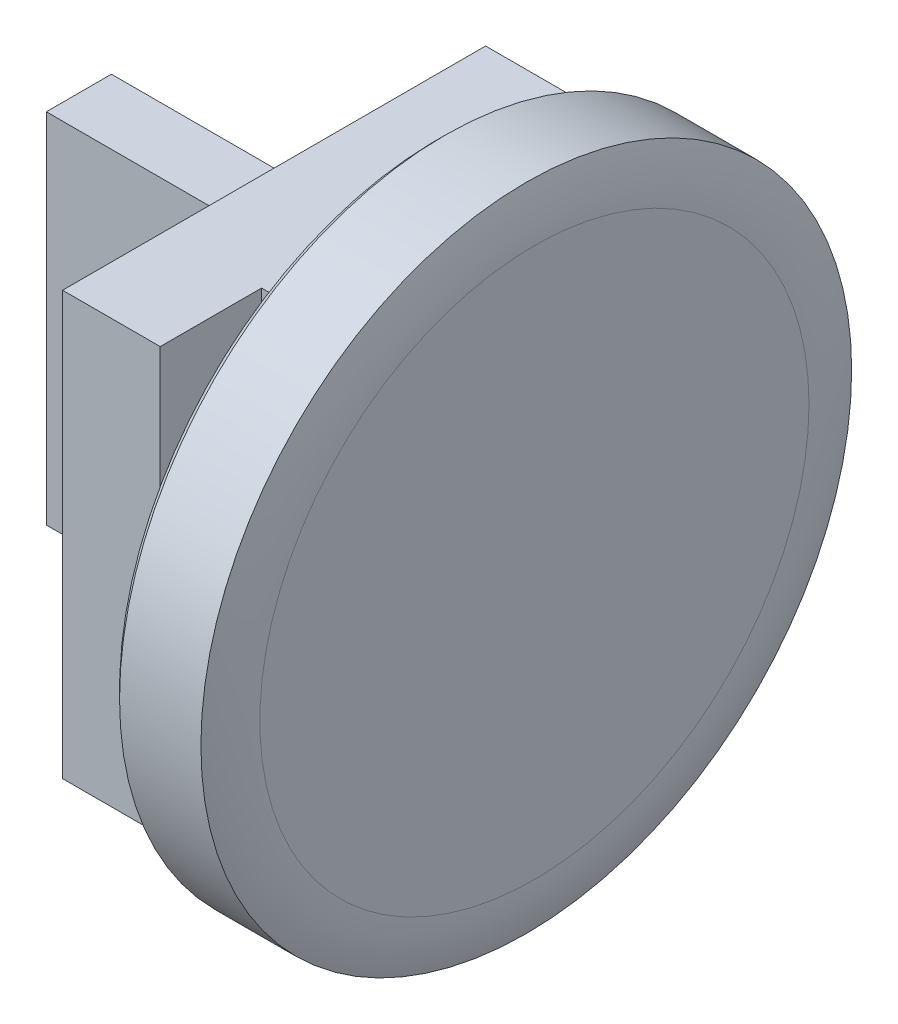
ISO-10303-21;
HEADER;
FILE_DESCRIPTION(('STEP AP214'),'2;1');
FILE_NAME('part.step','',(''),(''),'','','');
FILE_SCHEMA(('AUTOMOTIVE_DESIGN { 1 0 10303 214 1 1 1 1 }'));
ENDSEC;
DATA;
#1=APPLICATION_CONTEXT('core data for automotive mechanical design processes');
#2=APPLICATION_PROTOCOL_DEFINITION('international standard','automotive_design',2000,#1);
#3=PRODUCT_CONTEXT('',#1,'mechanical');
#4=PRODUCT('Part','Part','',(#3));
#5=PRODUCT_RELATED_PRODUCT_CATEGORY('part','',(#4));
#6=PRODUCT_DEFINITION_FORMATION('','',#4);
#7=PRODUCT_DEFINITION_CONTEXT('part definition',#1,'design');
#8=PRODUCT_DEFINITION('design','',#6,#7);
#9=PRODUCT_DEFINITION_SHAPE('','',#8);
#10=(LENGTH_UNIT() NAMED_UNIT(*) SI_UNIT(.MILLI.,.METRE.));
#11=(NAMED_UNIT(*) PLANE_ANGLE_UNIT() SI_UNIT($,.RADIAN.));
#12=(NAMED_UNIT(*) SI_UNIT($,.STERADIAN.) SOLID_ANGLE_UNIT());
#13=UNCERTAINTY_MEASURE_WITH_UNIT(LENGTH_MEASURE(1.E-05),#10,'distance_accuracy_value','');
#14=(GEOMETRIC_REPRESENTATION_CONTEXT(3) GLOBAL_UNCERTAINTY_ASSIGNED_CONTEXT((#13)) GLOBAL_UNIT_ASSIGNED_CONTEXT((#10,
#11,#12)) REPRESENTATION_CONTEXT('',''));
#15=CARTESIAN_POINT('',(0.,0.,0.));
#16=DIRECTION('',(0.,0.,1.));
#17=DIRECTION('',(1.,0.,0.));
#18=AXIS2_PLACEMENT_3D('',#15,#16,#17);
#19=CARTESIAN_POINT('',(-1.5,13.,6.5));
#20=DIRECTION('',(-1.,0.,0.));
#21=DIRECTION('',(0.,0.,1.));
#22=AXIS2_PLACEMENT_3D('',#19,#20,#21);
#23=PLANE('',#22);
#24=DIRECTION('',(0.,0.,-1.));
#25=VECTOR('',#24,1.);
#26=CARTESIAN_POINT('',(-1.5,0.,6.5));
#27=LINE('',#26,#25);
#28=CARTESIAN_POINT('',(-1.5,0.,6.5));
#29=VERTEX_POINT('',#28);
#30=CARTESIAN_POINT('',(-1.5,0.,-6.5));
#31=VERTEX_POINT('',#30);
#32=EDGE_CURVE('E242',#29,#31,#27,.T.);
#33=ORIENTED_EDGE('',*,*,#32,.F.);
#34=DIRECTION('',(0.,-1.,0.));
#35=VECTOR('',#34,1.);
#36=CARTESIAN_POINT('',(-1.5,13.,6.5));
#37=LINE('',#36,#35);
#38=CARTESIAN_POINT('',(-1.5,13.,6.5));
#39=VERTEX_POINT('',#38);
#40=EDGE_CURVE('E252',#39,#29,#37,.T.);
#41=ORIENTED_EDGE('',*,*,#40,.F.);
#42=DIRECTION('',(0.,0.,-1.));
#43=VECTOR('',#42,1.);
#44=CARTESIAN_POINT('',(-1.5,13.,6.5));
#45=LINE('',#44,#43);
#46=CARTESIAN_POINT('',(-1.5,13.,-6.5));
#47=VERTEX_POINT('',#46);
#48=EDGE_CURVE('E249',#39,#47,#45,.T.);
#49=ORIENTED_EDGE('',*,*,#48,.T.);
#50=DIRECTION('',(0.,-1.,0.));
#51=VECTOR('',#50,1.);
#52=CARTESIAN_POINT('',(-1.5,13.,-6.5));
#53=LINE('',#52,#51);
#54=EDGE_CURVE('E264',#47,#31,#53,.T.);
#55=ORIENTED_EDGE('',*,*,#54,.T.);
#56=EDGE_LOOP('',(#33,#41,#49,#55));
#57=FACE_BOUND('',#56,.T.);
#58=DIRECTION('',(0.,-1.,0.));
#59=VECTOR('',#58,1.);
#60=CARTESIAN_POINT('',(-1.5,12.,-1.));
#61=LINE('',#60,#59);
#62=CARTESIAN_POINT('',(-1.5,12.,-1.));
#63=VERTEX_POINT('',#62);
#64=CARTESIAN_POINT('',(-1.5,1.,-1.));
#65=VERTEX_POINT('',#64);
#66=EDGE_CURVE('E180',#63,#65,#61,.T.);
#67=ORIENTED_EDGE('',*,*,#66,.F.);
#68=DIRECTION('',(0.,0.,1.));
#69=VECTOR('',#68,1.);
#70=CARTESIAN_POINT('',(-1.5,12.,-1.));
#71=LINE('',#70,#69);
#72=CARTESIAN_POINT('',(-1.5,12.,0.999999999999999));
#73=VERTEX_POINT('',#72);
#74=EDGE_CURVE('E173',#63,#73,#71,.T.);
#75=ORIENTED_EDGE('',*,*,#74,.T.);
#76=DIRECTION('',(0.,-1.,0.));
#77=VECTOR('',#76,1.);
#78=CARTESIAN_POINT('',(-1.5,12.,0.999999999999999));
#79=LINE('',#78,#77);
#80=CARTESIAN_POINT('',(-1.5,1.,1.));
#81=VERTEX_POINT('',#80);
#82=EDGE_CURVE('E189',#73,#81,#79,.T.);
#83=ORIENTED_EDGE('',*,*,#82,.T.);
#84=DIRECTION('',(0.,0.,1.));
#85=VECTOR('',#84,1.);
#86=CARTESIAN_POINT('',(-1.5,1.,-1.));
#87=LINE('',#86,#85);
#88=EDGE_CURVE('E191',#65,#81,#87,.T.);
#89=ORIENTED_EDGE('',*,*,#88,.F.);
#90=EDGE_LOOP('',(#67,#75,#83,#89));
#91=FACE_BOUND('',#90,.T.);
#92=ADVANCED_FACE('F35',(#57,#91),#23,.T.);
#93=CARTESIAN_POINT('',(1.5,13.,6.5));
#94=DIRECTION('',(-1.,0.,0.));
#95=DIRECTION('',(0.,0.,1.));
#96=AXIS2_PLACEMENT_3D('',#93,#94,#95);
#97=PLANE('',#96);
#98=DIRECTION('',(0.,1.,0.));
#99=VECTOR('',#98,1.);
#100=CARTESIAN_POINT('',(1.5,0.,-3.38490549831007));
#101=LINE('',#100,#99);
#102=CARTESIAN_POINT('',(1.5,0.,-3.38490549831007));
#103=VERTEX_POINT('',#102);
#104=CARTESIAN_POINT('',(1.5,13.,-3.38490549831007));
#105=VERTEX_POINT('',#104);
#106=EDGE_CURVE('E199',#103,#105,#101,.T.);
#107=ORIENTED_EDGE('',*,*,#106,.F.);
#108=DIRECTION('',(0.,0.,-1.));
#109=VECTOR('',#108,1.);
#110=CARTESIAN_POINT('',(1.5,0.,6.5));
#111=LINE('',#110,#109);
#112=CARTESIAN_POINT('',(1.5,0.,-6.5));
#113=VERTEX_POINT('',#112);
#114=EDGE_CURVE('E255',#103,#113,#111,.T.);
#115=ORIENTED_EDGE('',*,*,#114,.T.);
#116=DIRECTION('',(0.,-1.,0.));
#117=VECTOR('',#116,1.);
#118=CARTESIAN_POINT('',(1.5,13.,-6.5));
#119=LINE('',#118,#117);
#120=CARTESIAN_POINT('',(1.5,13.,-6.5));
#121=VERTEX_POINT('',#120);
#122=EDGE_CURVE('E266',#121,#113,#119,.T.);
#123=ORIENTED_EDGE('',*,*,#122,.F.);
#124=DIRECTION('',(0.,0.,-1.));
#125=VECTOR('',#124,1.);
#126=CARTESIAN_POINT('',(1.5,13.,6.5));
#127=LINE('',#126,#125);
#128=EDGE_CURVE('E241',#105,#121,#127,.T.);
#129=ORIENTED_EDGE('',*,*,#128,.F.);
#130=EDGE_LOOP('',(#107,#115,#123,#129));
#131=FACE_BOUND('',#130,.T.);
#132=ADVANCED_FACE('F307',(#131),#97,.F.);
#133=DIRECTION('',(0.,-1.,0.));
#134=VECTOR('',#133,1.);
#135=CARTESIAN_POINT('',(1.5,0.,3.38490549831007));
#136=LINE('',#135,#134);
#137=CARTESIAN_POINT('',(1.5,13.,3.38490549831007));
#138=VERTEX_POINT('',#137);
#139=CARTESIAN_POINT('',(1.5,0.,3.38490549831007));
#140=VERTEX_POINT('',#139);
#141=EDGE_CURVE('E212',#138,#140,#136,.T.);
#142=ORIENTED_EDGE('',*,*,#141,.F.);
#143=CARTESIAN_POINT('',(1.5,13.,6.5));
#144=VERTEX_POINT('',#143);
#145=EDGE_CURVE('E243',#144,#138,#127,.T.);
#146=ORIENTED_EDGE('',*,*,#145,.F.);
#147=DIRECTION('',(0.,-1.,0.));
#148=VECTOR('',#147,1.);
#149=CARTESIAN_POINT('',(1.5,13.,6.5));
#150=LINE('',#149,#148);
#151=CARTESIAN_POINT('',(1.5,0.,6.5));
#152=VERTEX_POINT('',#151);
#153=EDGE_CURVE('E269',#144,#152,#150,.T.);
#154=ORIENTED_EDGE('',*,*,#153,.T.);
#155=EDGE_CURVE('E256',#152,#140,#111,.T.);
#156=ORIENTED_EDGE('',*,*,#155,.T.);
#157=EDGE_LOOP('',(#142,#146,#154,#156));
#158=FACE_BOUND('',#157,.T.);
#159=ADVANCED_FACE('F313',(#158),#97,.F.);
#160=CARTESIAN_POINT('',(-1.5,13.,6.5));
#161=DIRECTION('',(0.,0.,-1.));
#162=DIRECTION('',(-1.,0.,0.));
#163=AXIS2_PLACEMENT_3D('',#160,#161,#162);
#164=PLANE('',#163);
#165=DIRECTION('',(1.,0.,0.));
#166=VECTOR('',#165,1.);
#167=CARTESIAN_POINT('',(-1.5,0.,6.5));
#168=LINE('',#167,#166);
#169=EDGE_CURVE('E237',#29,#152,#168,.T.);
#170=ORIENTED_EDGE('',*,*,#169,.T.);
#171=ORIENTED_EDGE('',*,*,#153,.F.);
#172=DIRECTION('',(1.,0.,0.));
#173=VECTOR('',#172,1.);
#174=CARTESIAN_POINT('',(-1.5,13.,6.5));
#175=LINE('',#174,#173);
#176=EDGE_CURVE('E238',#39,#144,#175,.T.);
#177=ORIENTED_EDGE('',*,*,#176,.F.);
#178=ORIENTED_EDGE('',*,*,#40,.T.);
#179=EDGE_LOOP('',(#170,#171,#177,#178));
#180=FACE_BOUND('',#179,.T.);
#181=ADVANCED_FACE('F325',(#180),#164,.F.);
#182=CARTESIAN_POINT('',(-1.5,13.,-6.5));
#183=DIRECTION('',(0.,0.,-1.));
#184=DIRECTION('',(-1.,0.,0.));
#185=AXIS2_PLACEMENT_3D('',#182,#183,#184);
#186=PLANE('',#185);
#187=DIRECTION('',(1.,0.,0.));
#188=VECTOR('',#187,1.);
#189=CARTESIAN_POINT('',(-1.5,0.,-6.5));
#190=LINE('',#189,#188);
#191=EDGE_CURVE('E258',#31,#113,#190,.T.);
#192=ORIENTED_EDGE('',*,*,#191,.F.);
#193=ORIENTED_EDGE('',*,*,#54,.F.);
#194=DIRECTION('',(1.,0.,0.));
#195=VECTOR('',#194,1.);
#196=CARTESIAN_POINT('',(-1.5,13.,-6.5));
#197=LINE('',#196,#195);
#198=EDGE_CURVE('E246',#47,#121,#197,.T.);
#199=ORIENTED_EDGE('',*,*,#198,.T.);
#200=ORIENTED_EDGE('',*,*,#122,.T.);
#201=EDGE_LOOP('',(#192,#193,#199,#200));
#202=FACE_BOUND('',#201,.T.);
#203=ADVANCED_FACE('F322',(#202),#186,.T.);
#204=CARTESIAN_POINT('',(0.,13.,0.));
#205=DIRECTION('',(0.,1.,0.));
#206=DIRECTION('',(0.,0.,1.));
#207=AXIS2_PLACEMENT_3D('',#204,#205,#206);
#208=PLANE('',#207);
#209=ORIENTED_EDGE('',*,*,#176,.T.);
#210=ORIENTED_EDGE('',*,*,#145,.T.);
#211=DIRECTION('',(-1.,0.,0.));
#212=VECTOR('',#211,1.);
#213=CARTESIAN_POINT('',(3.5,13.,3.38490549831007));
#214=LINE('',#213,#212);
#215=CARTESIAN_POINT('',(3.5,13.,3.38490549831007));
#216=VERTEX_POINT('',#215);
#217=EDGE_CURVE('E231',#216,#138,#214,.T.);
#218=ORIENTED_EDGE('',*,*,#217,.F.);
#219=DIRECTION('',(0.,0.,1.));
#220=VECTOR('',#219,1.);
#221=CARTESIAN_POINT('',(3.5,13.,3.38490549831007));
#222=LINE('',#221,#220);
#223=CARTESIAN_POINT('',(3.5,13.,-3.38490549831007));
#224=VERTEX_POINT('',#223);
#225=EDGE_CURVE('E211',#224,#216,#222,.T.);
#226=ORIENTED_EDGE('',*,*,#225,.F.);
#227=DIRECTION('',(-1.,0.,0.));
#228=VECTOR('',#227,1.);
#229=CARTESIAN_POINT('',(3.5,13.,-3.38490549831007));
#230=LINE('',#229,#228);
#231=EDGE_CURVE('E234',#224,#105,#230,.T.);
#232=ORIENTED_EDGE('',*,*,#231,.T.);
#233=ORIENTED_EDGE('',*,*,#128,.T.);
#234=ORIENTED_EDGE('',*,*,#198,.F.);
#235=ORIENTED_EDGE('',*,*,#48,.F.);
#236=EDGE_LOOP('',(#209,#210,#218,#226,#232,#233,#234,#235));
#237=FACE_BOUND('',#236,.T.);
#238=ADVANCED_FACE('F324',(#237),#208,.T.);
#239=CARTESIAN_POINT('',(0.,0.,0.));
#240=DIRECTION('',(0.,1.,0.));
#241=DIRECTION('',(0.,0.,1.));
#242=AXIS2_PLACEMENT_3D('',#239,#240,#241);
#243=PLANE('',#242);
#244=ORIENTED_EDGE('',*,*,#169,.F.);
#245=ORIENTED_EDGE('',*,*,#32,.T.);
#246=ORIENTED_EDGE('',*,*,#191,.T.);
#247=ORIENTED_EDGE('',*,*,#114,.F.);
#248=DIRECTION('',(-1.,0.,0.));
#249=VECTOR('',#248,1.);
#250=CARTESIAN_POINT('',(3.5,0.,-3.38490549831007));
#251=LINE('',#250,#249);
#252=CARTESIAN_POINT('',(3.5,0.,-3.38490549831007));
#253=VERTEX_POINT('',#252);
#254=EDGE_CURVE('E221',#253,#103,#251,.T.);
#255=ORIENTED_EDGE('',*,*,#254,.F.);
#256=DIRECTION('',(0.,0.,-1.));
#257=VECTOR('',#256,1.);
#258=CARTESIAN_POINT('',(3.5,0.,3.38490549831007));
#259=LINE('',#258,#257);
#260=CARTESIAN_POINT('',(3.5,0.,3.38490549831007));
#261=VERTEX_POINT('',#260);
#262=EDGE_CURVE('E218',#261,#253,#259,.T.);
#263=ORIENTED_EDGE('',*,*,#262,.F.);
#264=DIRECTION('',(-1.,0.,0.));
#265=VECTOR('',#264,1.);
#266=CARTESIAN_POINT('',(3.5,0.,3.38490549831007));
#267=LINE('',#266,#265);
#268=EDGE_CURVE('E228',#261,#140,#267,.T.);
#269=ORIENTED_EDGE('',*,*,#268,.T.);
#270=ORIENTED_EDGE('',*,*,#155,.F.);
#271=EDGE_LOOP('',(#244,#245,#246,#247,#255,#263,#269,#270));
#272=FACE_BOUND('',#271,.T.);
#273=ADVANCED_FACE('F320',(#272),#243,.F.);
#274=CARTESIAN_POINT('',(3.5,0.,-3.38490549831007));
#275=DIRECTION('',(0.,0.,1.));
#276=DIRECTION('',(1.,0.,0.));
#277=AXIS2_PLACEMENT_3D('',#274,#275,#276);
#278=PLANE('',#277);
#279=ORIENTED_EDGE('',*,*,#106,.T.);
#280=ORIENTED_EDGE('',*,*,#231,.F.);
#281=DIRECTION('',(0.,1.,0.));
#282=VECTOR('',#281,1.);
#283=CARTESIAN_POINT('',(3.5,0.,-3.38490549831007));
#284=LINE('',#283,#282);
#285=EDGE_CURVE('E208',#253,#224,#284,.T.);
#286=ORIENTED_EDGE('',*,*,#285,.F.);
#287=ORIENTED_EDGE('',*,*,#254,.T.);
#288=EDGE_LOOP('',(#279,#280,#286,#287));
#289=FACE_BOUND('',#288,.T.);
#290=ADVANCED_FACE('F363',(#289),#278,.F.);
#291=CARTESIAN_POINT('',(3.5,0.,3.38490549831007));
#292=DIRECTION('',(0.,0.,-1.));
#293=DIRECTION('',(0.,1.,0.));
#294=AXIS2_PLACEMENT_3D('',#291,#292,#293);
#295=PLANE('',#294);
#296=ORIENTED_EDGE('',*,*,#141,.T.);
#297=ORIENTED_EDGE('',*,*,#268,.F.);
#298=DIRECTION('',(0.,-1.,0.));
#299=VECTOR('',#298,1.);
#300=CARTESIAN_POINT('',(3.5,0.,3.38490549831007));
#301=LINE('',#300,#299);
#302=EDGE_CURVE('E215',#216,#261,#301,.T.);
#303=ORIENTED_EDGE('',*,*,#302,.F.);
#304=ORIENTED_EDGE('',*,*,#217,.T.);
#305=EDGE_LOOP('',(#296,#297,#303,#304));
#306=FACE_BOUND('',#305,.T.);
#307=ADVANCED_FACE('F357',(#306),#295,.F.);
#308=CARTESIAN_POINT('',(3.5,6.5,0.));
#309=DIRECTION('',(1.,0.,0.));
#310=DIRECTION('',(0.,0.,-1.));
#311=AXIS2_PLACEMENT_3D('',#308,#309,#310);
#312=PLANE('',#311);
#313=CARTESIAN_POINT('',(3.5,6.5,0.));
#314=DIRECTION('',(1.,0.,0.));
#315=DIRECTION('',(0.,0.,-1.));
#316=AXIS2_PLACEMENT_3D('',#313,#314,#315);
#317=CIRCLE('',#316,9.75);
#318=CARTESIAN_POINT('',(3.5,6.5,-9.75000000000001));
#319=VERTEX_POINT('',#318);
#320=EDGE_CURVE('E278',#319,#319,#317,.F.);
#321=ORIENTED_EDGE('',*,*,#320,.T.);
#322=EDGE_LOOP('',(#321));
#323=FACE_BOUND('',#322,.T.);
#324=ORIENTED_EDGE('',*,*,#262,.T.);
#325=ORIENTED_EDGE('',*,*,#285,.T.);
#326=ORIENTED_EDGE('',*,*,#225,.T.);
#327=ORIENTED_EDGE('',*,*,#302,.T.);
#328=EDGE_LOOP('',(#324,#325,#326,#327));
#329=FACE_BOUND('',#328,.T.);
#330=ADVANCED_FACE('F349',(#323,#329),#312,.F.);
#331=CARTESIAN_POINT('',(6.5,6.5,0.));
#332=DIRECTION('',(-1.,0.,0.));
#333=DIRECTION('',(0.,0.,1.));
#334=AXIS2_PLACEMENT_3D('',#331,#332,#333);
#335=CYLINDRICAL_SURFACE('',#334,10.);
#336=CARTESIAN_POINT('',(3.75,6.5,0.));
#337=DIRECTION('',(1.,0.,0.));
#338=DIRECTION('',(0.,0.,-1.));
#339=AXIS2_PLACEMENT_3D('',#336,#337,#338);
#340=CIRCLE('',#339,10.);
#341=CARTESIAN_POINT('',(3.75,6.5,-10.));
#342=VERTEX_POINT('',#341);
#343=EDGE_CURVE('E275',#342,#342,#340,.T.);
#344=ORIENTED_EDGE('',*,*,#343,.T.);
#345=EDGE_LOOP('',(#344));
#346=FACE_BOUND('',#345,.T.);
#347=CARTESIAN_POINT('',(6.25,6.5,0.));
#348=DIRECTION('',(1.,0.,0.));
#349=DIRECTION('',(0.,0.,-1.));
#350=AXIS2_PLACEMENT_3D('',#347,#348,#349);
#351=CIRCLE('',#350,10.);
#352=CARTESIAN_POINT('',(6.25,6.5,-10.));
#353=VERTEX_POINT('',#352);
#354=EDGE_CURVE('E272',#353,#353,#351,.F.);
#355=ORIENTED_EDGE('',*,*,#354,.T.);
#356=EDGE_LOOP('',(#355));
#357=FACE_BOUND('',#356,.T.);
#358=ADVANCED_FACE('F340',(#346,#357),#335,.T.);
#359=CARTESIAN_POINT('',(6.5,6.5,0.));
#360=DIRECTION('',(1.,0.,0.));
#361=DIRECTION('',(0.,0.,-1.));
#362=AXIS2_PLACEMENT_3D('',#359,#360,#361);
#363=PLANE('',#362);
#364=CARTESIAN_POINT('',(6.5,6.5,0.));
#365=DIRECTION('',(1.,0.,0.));
#366=DIRECTION('',(0.,0.,-1.));
#367=AXIS2_PLACEMENT_3D('',#364,#365,#366);
#368=CIRCLE('',#367,8.43875050040041);
#369=CARTESIAN_POINT('',(6.5,6.5,-8.43875050040042));
#370=VERTEX_POINT('',#369);
#371=EDGE_CURVE('E281',#370,#370,#368,.T.);
#372=ORIENTED_EDGE('',*,*,#371,.T.);
#373=EDGE_LOOP('',(#372));
#374=FACE_BOUND('',#373,.T.);
#375=ADVANCED_FACE('F332',(#374),#363,.T.);
#376=CARTESIAN_POINT('',(3.75,6.5,0.));
#377=DIRECTION('',(1.,0.,0.));
#378=DIRECTION('',(0.,0.,-1.));
#379=AXIS2_PLACEMENT_3D('',#376,#377,#378);
#380=CONICAL_SURFACE('',#379,10.,0.785398163397448);
#381=ORIENTED_EDGE('',*,*,#320,.F.);
#382=EDGE_LOOP('',(#381));
#383=FACE_BOUND('',#382,.T.);
#384=ORIENTED_EDGE('',*,*,#343,.F.);
#385=EDGE_LOOP('',(#384));
#386=FACE_BOUND('',#385,.T.);
#387=ADVANCED_FACE('F330',(#383,#386),#380,.T.);
#388=CARTESIAN_POINT('',(1.5,6.5,0.));
#389=DIRECTION('',(-1.,0.,0.));
#390=DIRECTION('',(0.,0.,1.));
#391=AXIS2_PLACEMENT_3D('',#388,#389,#390);
#392=TOROIDAL_SURFACE('',#391,8.43875050040041,5.);
#393=ORIENTED_EDGE('',*,*,#354,.F.);
#394=EDGE_LOOP('',(#393));
#395=FACE_BOUND('',#394,.T.);
#396=ORIENTED_EDGE('',*,*,#371,.F.);
#397=EDGE_LOOP('',(#396));
#398=FACE_BOUND('',#397,.T.);
#399=ADVANCED_FACE('F37',(#395,#398),#392,.T.);
#400=CARTESIAN_POINT('',(-7.5,12.,-1.));
#401=DIRECTION('',(0.,1.,0.));
#402=DIRECTION('',(0.,0.,1.));
#403=AXIS2_PLACEMENT_3D('',#400,#401,#402);
#404=PLANE('',#403);
#405=ORIENTED_EDGE('',*,*,#74,.F.);
#406=DIRECTION('',(1.,0.,0.));
#407=VECTOR('',#406,1.);
#408=CARTESIAN_POINT('',(-7.5,12.,-1.));
#409=LINE('',#408,#407);
#410=CARTESIAN_POINT('',(-7.5,12.,-1.));
#411=VERTEX_POINT('',#410);
#412=EDGE_CURVE('E196',#411,#63,#409,.T.);
#413=ORIENTED_EDGE('',*,*,#412,.F.);
#414=DIRECTION('',(0.,0.,1.));
#415=VECTOR('',#414,1.);
#416=CARTESIAN_POINT('',(-7.5,12.,-1.));
#417=LINE('',#416,#415);
#418=CARTESIAN_POINT('',(-7.5,12.,0.999999999999999));
#419=VERTEX_POINT('',#418);
#420=EDGE_CURVE('E176',#411,#419,#417,.T.);
#421=ORIENTED_EDGE('',*,*,#420,.T.);
#422=DIRECTION('',(1.,0.,0.));
#423=VECTOR('',#422,1.);
#424=CARTESIAN_POINT('',(-7.5,12.,0.999999999999999));
#425=LINE('',#424,#423);
#426=EDGE_CURVE('E187',#419,#73,#425,.T.);
#427=ORIENTED_EDGE('',*,*,#426,.T.);
#428=EDGE_LOOP('',(#405,#413,#421,#427));
#429=FACE_BOUND('',#428,.T.);
#430=ADVANCED_FACE('F338',(#429),#404,.T.);
#431=CARTESIAN_POINT('',(-7.5,12.,-1.));
#432=DIRECTION('',(0.,0.,1.));
#433=DIRECTION('',(0.,-1.,0.));
#434=AXIS2_PLACEMENT_3D('',#431,#432,#433);
#435=PLANE('',#434);
#436=DIRECTION('',(1.,0.,0.));
#437=VECTOR('',#436,1.);
#438=CARTESIAN_POINT('',(-4.5,8.5,-1.));
#439=LINE('',#438,#437);
#440=CARTESIAN_POINT('',(-5.5,8.5,-1.));
#441=VERTEX_POINT('',#440);
#442=CARTESIAN_POINT('',(-4.5,8.5,-1.));
#443=VERTEX_POINT('',#442);
#444=EDGE_CURVE('E159',#441,#443,#439,.T.);
#445=ORIENTED_EDGE('',*,*,#444,.F.);
#446=DIRECTION('',(0.,1.,0.));
#447=VECTOR('',#446,1.);
#448=CARTESIAN_POINT('',(-5.5,8.5,-1.));
#449=LINE('',#448,#447);
#450=CARTESIAN_POINT('',(-5.5,4.5,-1.));
#451=VERTEX_POINT('',#450);
#452=EDGE_CURVE('E50',#451,#441,#449,.T.);
#453=ORIENTED_EDGE('',*,*,#452,.F.);
#454=DIRECTION('',(-1.,0.,0.));
#455=VECTOR('',#454,1.);
#456=CARTESIAN_POINT('',(-4.5,4.5,-1.));
#457=LINE('',#456,#455);
#458=CARTESIAN_POINT('',(-4.5,4.5,-1.));
#459=VERTEX_POINT('',#458);
#460=EDGE_CURVE('E166',#459,#451,#457,.T.);
#461=ORIENTED_EDGE('',*,*,#460,.F.);
#462=DIRECTION('',(0.,-1.,0.));
#463=VECTOR('',#462,1.);
#464=CARTESIAN_POINT('',(-4.5,8.5,-1.));
#465=LINE('',#464,#463);
#466=EDGE_CURVE('E150',#443,#459,#465,.T.);
#467=ORIENTED_EDGE('',*,*,#466,.F.);
#468=EDGE_LOOP('',(#445,#453,#461,#467));
#469=FACE_BOUND('',#468,.T.);
#470=ORIENTED_EDGE('',*,*,#66,.T.);
#471=DIRECTION('',(1.,0.,0.));
#472=VECTOR('',#471,1.);
#473=CARTESIAN_POINT('',(-7.5,1.,-1.));
#474=LINE('',#473,#472);
#475=CARTESIAN_POINT('',(-7.5,1.,-1.));
#476=VERTEX_POINT('',#475);
#477=EDGE_CURVE('E200',#476,#65,#474,.T.);
#478=ORIENTED_EDGE('',*,*,#477,.F.);
#479=DIRECTION('',(0.,-1.,0.));
#480=VECTOR('',#479,1.);
#481=CARTESIAN_POINT('',(-7.5,12.,-1.));
#482=LINE('',#481,#480);
#483=EDGE_CURVE('E185',#411,#476,#482,.T.);
#484=ORIENTED_EDGE('',*,*,#483,.F.);
#485=ORIENTED_EDGE('',*,*,#412,.T.);
#486=EDGE_LOOP('',(#470,#478,#484,#485));
#487=FACE_BOUND('',#486,.T.);
#488=ADVANCED_FACE('F163',(#469,#487),#435,.F.);
#489=CARTESIAN_POINT('',(-7.5,1.,-1.));
#490=DIRECTION('',(0.,1.,0.));
#491=DIRECTION('',(0.,0.,1.));
#492=AXIS2_PLACEMENT_3D('',#489,#490,#491);
#493=PLANE('',#492);
#494=ORIENTED_EDGE('',*,*,#88,.T.);
#495=DIRECTION('',(1.,0.,0.));
#496=VECTOR('',#495,1.);
#497=CARTESIAN_POINT('',(-7.5,1.,1.));
#498=LINE('',#497,#496);
#499=CARTESIAN_POINT('',(-7.5,1.,1.));
#500=VERTEX_POINT('',#499);
#501=EDGE_CURVE('E203',#500,#81,#498,.T.);
#502=ORIENTED_EDGE('',*,*,#501,.F.);
#503=DIRECTION('',(0.,0.,1.));
#504=VECTOR('',#503,1.);
#505=CARTESIAN_POINT('',(-7.5,1.,-1.));
#506=LINE('',#505,#504);
#507=EDGE_CURVE('E183',#476,#500,#506,.T.);
#508=ORIENTED_EDGE('',*,*,#507,.F.);
#509=ORIENTED_EDGE('',*,*,#477,.T.);
#510=EDGE_LOOP('',(#494,#502,#508,#509));
#511=FACE_BOUND('',#510,.T.);
#512=ADVANCED_FACE('F478',(#511),#493,.F.);
#513=CARTESIAN_POINT('',(-7.5,12.,0.999999999999999));
#514=DIRECTION('',(0.,0.,1.));
#515=DIRECTION('',(0.,-1.,0.));
#516=AXIS2_PLACEMENT_3D('',#513,#514,#515);
#517=PLANE('',#516);
#518=DIRECTION('',(0.,-1.,0.));
#519=VECTOR('',#518,1.);
#520=CARTESIAN_POINT('',(-5.5,12.,0.999999999999999));
#521=LINE('',#520,#519);
#522=CARTESIAN_POINT('',(-5.5,8.5,0.999999999999999));
#523=VERTEX_POINT('',#522);
#524=CARTESIAN_POINT('',(-5.5,4.5,0.999999999999999));
#525=VERTEX_POINT('',#524);
#526=EDGE_CURVE('E11',#523,#525,#521,.T.);
#527=ORIENTED_EDGE('',*,*,#526,.F.);
#528=DIRECTION('',(-1.,0.,0.));
#529=VECTOR('',#528,1.);
#530=CARTESIAN_POINT('',(-7.5,8.5,0.999999999999999));
#531=LINE('',#530,#529);
#532=CARTESIAN_POINT('',(-4.5,8.5,0.999999999999999));
#533=VERTEX_POINT('',#532);
#534=EDGE_CURVE('E284',#533,#523,#531,.T.);
#535=ORIENTED_EDGE('',*,*,#534,.F.);
#536=DIRECTION('',(0.,1.,0.));
#537=VECTOR('',#536,1.);
#538=CARTESIAN_POINT('',(-4.5,12.,0.999999999999999));
#539=LINE('',#538,#537);
#540=CARTESIAN_POINT('',(-4.5,4.5,0.999999999999999));
#541=VERTEX_POINT('',#540);
#542=EDGE_CURVE('E153',#541,#533,#539,.T.);
#543=ORIENTED_EDGE('',*,*,#542,.F.);
#544=DIRECTION('',(1.,0.,0.));
#545=VECTOR('',#544,1.);
#546=CARTESIAN_POINT('',(-7.5,4.5,1.));
#547=LINE('',#546,#545);
#548=EDGE_CURVE('E43',#525,#541,#547,.T.);
#549=ORIENTED_EDGE('',*,*,#548,.F.);
#550=EDGE_LOOP('',(#527,#535,#543,#549));
#551=FACE_BOUND('',#550,.T.);
#552=ORIENTED_EDGE('',*,*,#82,.F.);
#553=ORIENTED_EDGE('',*,*,#426,.F.);
#554=DIRECTION('',(0.,-1.,0.));
#555=VECTOR('',#554,1.);
#556=CARTESIAN_POINT('',(-7.5,12.,0.999999999999999));
#557=LINE('',#556,#555);
#558=EDGE_CURVE('E179',#419,#500,#557,.T.);
#559=ORIENTED_EDGE('',*,*,#558,.T.);
#560=ORIENTED_EDGE('',*,*,#501,.T.);
#561=EDGE_LOOP('',(#552,#553,#559,#560));
#562=FACE_BOUND('',#561,.T.);
#563=ADVANCED_FACE('F292',(#551,#562),#517,.T.);
#564=CARTESIAN_POINT('',(-7.5,0.,0.));
#565=DIRECTION('',(1.,0.,0.));
#566=DIRECTION('',(0.,0.,-1.));
#567=AXIS2_PLACEMENT_3D('',#564,#565,#566);
#568=PLANE('',#567);
#569=ORIENTED_EDGE('',*,*,#420,.F.);
#570=ORIENTED_EDGE('',*,*,#483,.T.);
#571=ORIENTED_EDGE('',*,*,#507,.T.);
#572=ORIENTED_EDGE('',*,*,#558,.F.);
#573=EDGE_LOOP('',(#569,#570,#571,#572));
#574=FACE_BOUND('',#573,.T.);
#575=ADVANCED_FACE('F296',(#574),#568,.F.);
#576=CARTESIAN_POINT('',(-5.5,8.5,5.));
#577=DIRECTION('',(-1.,0.,0.));
#578=DIRECTION('',(0.,0.,1.));
#579=AXIS2_PLACEMENT_3D('',#576,#577,#578);
#580=PLANE('',#579);
#581=ORIENTED_EDGE('',*,*,#526,.T.);
#582=DIRECTION('',(0.,0.,-1.));
#583=VECTOR('',#582,1.);
#584=CARTESIAN_POINT('',(-5.5,4.5,5.));
#585=LINE('',#584,#583);
#586=EDGE_CURVE('E171',#525,#451,#585,.T.);
#587=ORIENTED_EDGE('',*,*,#586,.T.);
#588=ORIENTED_EDGE('',*,*,#452,.T.);
#589=DIRECTION('',(0.,0.,-1.));
#590=VECTOR('',#589,1.);
#591=CARTESIAN_POINT('',(-5.5,8.5,5.));
#592=LINE('',#591,#590);
#593=EDGE_CURVE('E156',#523,#441,#592,.T.);
#594=ORIENTED_EDGE('',*,*,#593,.F.);
#595=EDGE_LOOP('',(#581,#587,#588,#594));
#596=FACE_BOUND('',#595,.T.);
#597=ADVANCED_FACE('F294',(#596),#580,.F.);
#598=CARTESIAN_POINT('',(-4.5,4.5,5.));
#599=DIRECTION('',(0.,-1.,0.));
#600=DIRECTION('',(0.,0.,-1.));
#601=AXIS2_PLACEMENT_3D('',#598,#599,#600);
#602=PLANE('',#601);
#603=ORIENTED_EDGE('',*,*,#548,.T.);
#604=DIRECTION('',(0.,0.,-1.));
#605=VECTOR('',#604,1.);
#606=CARTESIAN_POINT('',(-4.5,4.5,5.));
#607=LINE('',#606,#605);
#608=EDGE_CURVE('E155',#541,#459,#607,.T.);
#609=ORIENTED_EDGE('',*,*,#608,.T.);
#610=ORIENTED_EDGE('',*,*,#460,.T.);
#611=ORIENTED_EDGE('',*,*,#586,.F.);
#612=EDGE_LOOP('',(#603,#609,#610,#611));
#613=FACE_BOUND('',#612,.T.);
#614=ADVANCED_FACE('F289',(#613),#602,.F.);
#615=CARTESIAN_POINT('',(-4.5,8.5,5.));
#616=DIRECTION('',(1.,0.,0.));
#617=DIRECTION('',(0.,0.,-1.));
#618=AXIS2_PLACEMENT_3D('',#615,#616,#617);
#619=PLANE('',#618);
#620=ORIENTED_EDGE('',*,*,#542,.T.);
#621=DIRECTION('',(0.,0.,-1.));
#622=VECTOR('',#621,1.);
#623=CARTESIAN_POINT('',(-4.5,8.5,5.));
#624=LINE('',#623,#622);
#625=EDGE_CURVE('E58',#533,#443,#624,.T.);
#626=ORIENTED_EDGE('',*,*,#625,.T.);
#627=ORIENTED_EDGE('',*,*,#466,.T.);
#628=ORIENTED_EDGE('',*,*,#608,.F.);
#629=EDGE_LOOP('',(#620,#626,#627,#628));
#630=FACE_BOUND('',#629,.T.);
#631=ADVANCED_FACE('F147',(#630),#619,.F.);
#632=CARTESIAN_POINT('',(-4.5,8.5,5.));
#633=DIRECTION('',(0.,1.,0.));
#634=DIRECTION('',(0.,0.,1.));
#635=AXIS2_PLACEMENT_3D('',#632,#633,#634);
#636=PLANE('',#635);
#637=ORIENTED_EDGE('',*,*,#534,.T.);
#638=ORIENTED_EDGE('',*,*,#593,.T.);
#639=ORIENTED_EDGE('',*,*,#444,.T.);
#640=ORIENTED_EDGE('',*,*,#625,.F.);
#641=EDGE_LOOP('',(#637,#638,#639,#640));
#642=FACE_BOUND('',#641,.T.);
#643=ADVANCED_FACE('F160',(#642),#636,.F.);
#644=CLOSED_SHELL('',(#92,#132,#159,#181,#203,#238,#273,#290,#307,#330,#358,#375,#387,#399,#430,
#488,#512,#563,#575,#597,#614,#631,#643));
#645=MANIFOLD_SOLID_BREP('B2',#644);
#646=ADVANCED_BREP_SHAPE_REPRESENTATION('',(#18,#645),#14);
#647=SHAPE_DEFINITION_REPRESENTATION(#9,#646);
ENDSEC;
END-ISO-10303-21;
